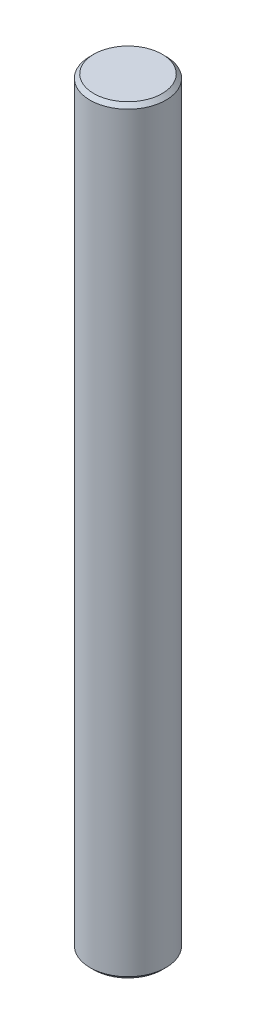
ISO-10303-21;
HEADER;
FILE_DESCRIPTION(('STEP AP214'),'2;1');
FILE_NAME('part.step','',(''),(''),'','','');
FILE_SCHEMA(('AUTOMOTIVE_DESIGN { 1 0 10303 214 1 1 1 1 }'));
ENDSEC;
DATA;
#1=APPLICATION_CONTEXT('core data for automotive mechanical design processes');
#2=APPLICATION_PROTOCOL_DEFINITION('international standard','automotive_design',2000,#1);
#3=PRODUCT_CONTEXT('',#1,'mechanical');
#4=PRODUCT('Part','Part','',(#3));
#5=PRODUCT_RELATED_PRODUCT_CATEGORY('part','',(#4));
#6=PRODUCT_DEFINITION_FORMATION('','',#4);
#7=PRODUCT_DEFINITION_CONTEXT('part definition',#1,'design');
#8=PRODUCT_DEFINITION('design','',#6,#7);
#9=PRODUCT_DEFINITION_SHAPE('','',#8);
#10=(LENGTH_UNIT() NAMED_UNIT(*) SI_UNIT(.MILLI.,.METRE.));
#11=(NAMED_UNIT(*) PLANE_ANGLE_UNIT() SI_UNIT($,.RADIAN.));
#12=(NAMED_UNIT(*) SI_UNIT($,.STERADIAN.) SOLID_ANGLE_UNIT());
#13=UNCERTAINTY_MEASURE_WITH_UNIT(LENGTH_MEASURE(1.E-05),#10,'distance_accuracy_value','');
#14=(GEOMETRIC_REPRESENTATION_CONTEXT(3) GLOBAL_UNCERTAINTY_ASSIGNED_CONTEXT((#13)) GLOBAL_UNIT_ASSIGNED_CONTEXT((#10,
#11,#12)) REPRESENTATION_CONTEXT('',''));
#15=CARTESIAN_POINT('',(0.,0.,0.));
#16=DIRECTION('',(0.,0.,1.));
#17=DIRECTION('',(1.,0.,0.));
#18=AXIS2_PLACEMENT_3D('',#15,#16,#17);
#19=CARTESIAN_POINT('',(0.,25.,0.));
#20=DIRECTION('',(0.,-1.,0.));
#21=DIRECTION('',(0.,0.,-1.));
#22=AXIS2_PLACEMENT_3D('',#19,#20,#21);
#23=CYLINDRICAL_SURFACE('',#22,2.5);
#24=CARTESIAN_POINT('',(0.,-24.75,0.));
#25=DIRECTION('',(0.,1.,0.));
#26=DIRECTION('',(0.,0.,1.));
#27=AXIS2_PLACEMENT_3D('',#24,#25,#26);
#28=CIRCLE('',#27,2.5);
#29=CARTESIAN_POINT('',(0.,-24.75,2.5));
#30=VERTEX_POINT('',#29);
#31=EDGE_CURVE('E49',#30,#30,#28,.T.);
#32=ORIENTED_EDGE('',*,*,#31,.T.);
#33=EDGE_LOOP('',(#32));
#34=FACE_BOUND('',#33,.T.);
#35=CARTESIAN_POINT('',(0.,24.75,0.));
#36=DIRECTION('',(0.,1.,0.));
#37=DIRECTION('',(0.,0.,1.));
#38=AXIS2_PLACEMENT_3D('',#35,#36,#37);
#39=CIRCLE('',#38,2.5);
#40=CARTESIAN_POINT('',(0.,24.75,2.5));
#41=VERTEX_POINT('',#40);
#42=EDGE_CURVE('E53',#41,#41,#39,.F.);
#43=ORIENTED_EDGE('',*,*,#42,.T.);
#44=EDGE_LOOP('',(#43));
#45=FACE_BOUND('',#44,.T.);
#46=ADVANCED_FACE('F37',(#34,#45),#23,.T.);
#47=CARTESIAN_POINT('',(0.,25.,0.));
#48=DIRECTION('',(0.,1.,0.));
#49=DIRECTION('',(0.,0.,1.));
#50=AXIS2_PLACEMENT_3D('',#47,#48,#49);
#51=PLANE('',#50);
#52=CARTESIAN_POINT('',(0.,25.,0.));
#53=DIRECTION('',(0.,1.,0.));
#54=DIRECTION('',(0.,0.,1.));
#55=AXIS2_PLACEMENT_3D('',#52,#53,#54);
#56=CIRCLE('',#55,2.24999999999999);
#57=CARTESIAN_POINT('',(0.,25.,2.24999999999999));
#58=VERTEX_POINT('',#57);
#59=EDGE_CURVE('E10',#58,#58,#56,.T.);
#60=ORIENTED_EDGE('',*,*,#59,.T.);
#61=EDGE_LOOP('',(#60));
#62=FACE_BOUND('',#61,.T.);
#63=ADVANCED_FACE('F69',(#62),#51,.T.);
#64=CARTESIAN_POINT('',(0.,-25.,0.));
#65=DIRECTION('',(0.,1.,0.));
#66=DIRECTION('',(0.,0.,1.));
#67=AXIS2_PLACEMENT_3D('',#64,#65,#66);
#68=PLANE('',#67);
#69=CARTESIAN_POINT('',(0.,-25.,0.));
#70=DIRECTION('',(0.,1.,0.));
#71=DIRECTION('',(0.,0.,1.));
#72=AXIS2_PLACEMENT_3D('',#69,#70,#71);
#73=CIRCLE('',#72,2.25);
#74=CARTESIAN_POINT('',(0.,-25.,2.25));
#75=VERTEX_POINT('',#74);
#76=EDGE_CURVE('E45',#75,#75,#73,.F.);
#77=ORIENTED_EDGE('',*,*,#76,.T.);
#78=EDGE_LOOP('',(#77));
#79=FACE_BOUND('',#78,.T.);
#80=ADVANCED_FACE('F66',(#79),#68,.F.);
#81=CARTESIAN_POINT('',(0.,-24.75,0.));
#82=DIRECTION('',(0.,1.,0.));
#83=DIRECTION('',(0.,0.,1.));
#84=AXIS2_PLACEMENT_3D('',#81,#82,#83);
#85=CONICAL_SURFACE('',#84,2.5,0.785398163397457);
#86=ORIENTED_EDGE('',*,*,#76,.F.);
#87=EDGE_LOOP('',(#86));
#88=FACE_BOUND('',#87,.T.);
#89=ORIENTED_EDGE('',*,*,#31,.F.);
#90=EDGE_LOOP('',(#89));
#91=FACE_BOUND('',#90,.T.);
#92=ADVANCED_FACE('F62',(#88,#91),#85,.T.);
#93=CARTESIAN_POINT('',(0.,25.,0.));
#94=DIRECTION('',(0.,-1.,0.));
#95=DIRECTION('',(0.,0.,-1.));
#96=AXIS2_PLACEMENT_3D('',#93,#94,#95);
#97=CONICAL_SURFACE('',#96,2.24999999999999,0.785398163397443);
#98=ORIENTED_EDGE('',*,*,#42,.F.);
#99=EDGE_LOOP('',(#98));
#100=FACE_BOUND('',#99,.T.);
#101=ORIENTED_EDGE('',*,*,#59,.F.);
#102=EDGE_LOOP('',(#101));
#103=FACE_BOUND('',#102,.T.);
#104=ADVANCED_FACE('F40',(#100,#103),#97,.T.);
#105=CLOSED_SHELL('',(#46,#63,#80,#92,#104));
#106=MANIFOLD_SOLID_BREP('B2',#105);
#107=ADVANCED_BREP_SHAPE_REPRESENTATION('',(#18,#106),#14);
#108=SHAPE_DEFINITION_REPRESENTATION(#9,#107);
ENDSEC;
END-ISO-10303-21;
